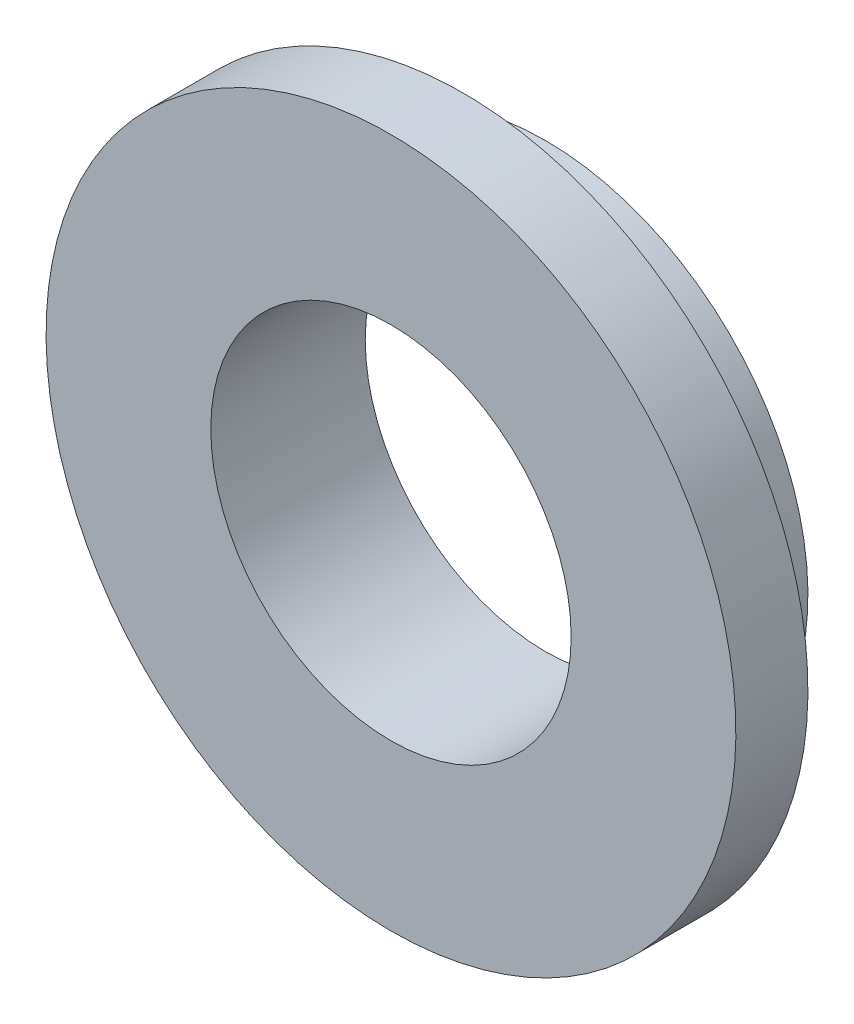
ISO-10303-21;
HEADER;
FILE_DESCRIPTION(('STEP AP214'),'2;1');
FILE_NAME('part.step','',(''),(''),'','','');
FILE_SCHEMA(('AUTOMOTIVE_DESIGN { 1 0 10303 214 1 1 1 1 }'));
ENDSEC;
DATA;
#1=APPLICATION_CONTEXT('core data for automotive mechanical design processes');
#2=APPLICATION_PROTOCOL_DEFINITION('international standard','automotive_design',2000,#1);
#3=PRODUCT_CONTEXT('',#1,'mechanical');
#4=PRODUCT('Part','Part','',(#3));
#5=PRODUCT_RELATED_PRODUCT_CATEGORY('part','',(#4));
#6=PRODUCT_DEFINITION_FORMATION('','',#4);
#7=PRODUCT_DEFINITION_CONTEXT('part definition',#1,'design');
#8=PRODUCT_DEFINITION('design','',#6,#7);
#9=PRODUCT_DEFINITION_SHAPE('','',#8);
#10=(LENGTH_UNIT() NAMED_UNIT(*) SI_UNIT(.MILLI.,.METRE.));
#11=(NAMED_UNIT(*) PLANE_ANGLE_UNIT() SI_UNIT($,.RADIAN.));
#12=(NAMED_UNIT(*) SI_UNIT($,.STERADIAN.) SOLID_ANGLE_UNIT());
#13=UNCERTAINTY_MEASURE_WITH_UNIT(LENGTH_MEASURE(1.E-05),#10,'distance_accuracy_value','');
#14=(GEOMETRIC_REPRESENTATION_CONTEXT(3) GLOBAL_UNCERTAINTY_ASSIGNED_CONTEXT((#13)) GLOBAL_UNIT_ASSIGNED_CONTEXT((#10,
#11,#12)) REPRESENTATION_CONTEXT('',''));
#15=CARTESIAN_POINT('',(0.,0.,0.));
#16=DIRECTION('',(0.,0.,1.));
#17=DIRECTION('',(1.,0.,0.));
#18=AXIS2_PLACEMENT_3D('',#15,#16,#17);
#19=CARTESIAN_POINT('',(-21.7679908457877,11.287620261908,13.2839378711217));
#20=DIRECTION('',(0.,0.,-1.));
#21=DIRECTION('',(0.,1.,0.));
#22=AXIS2_PLACEMENT_3D('',#19,#20,#21);
#23=CYLINDRICAL_SURFACE('',#22,12.75);
#24=CARTESIAN_POINT('',(-21.7679908457877,11.287620261908,9.28393787112174));
#25=DIRECTION('',(0.,0.,-1.));
#26=DIRECTION('',(0.,1.,0.));
#27=AXIS2_PLACEMENT_3D('',#24,#25,#26);
#28=CIRCLE('',#27,12.75);
#29=CARTESIAN_POINT('',(-21.7679908457877,24.037620261908,9.28393787112173));
#30=VERTEX_POINT('',#29);
#31=EDGE_CURVE('E18',#30,#30,#28,.F.);
#32=ORIENTED_EDGE('',*,*,#31,.T.);
#33=EDGE_LOOP('',(#32));
#34=FACE_BOUND('',#33,.T.);
#35=CARTESIAN_POINT('',(-21.7679908457877,11.287620261908,13.2839378711217));
#36=DIRECTION('',(0.,0.,-1.));
#37=DIRECTION('',(0.,1.,0.));
#38=AXIS2_PLACEMENT_3D('',#35,#36,#37);
#39=CIRCLE('',#38,12.75);
#40=CARTESIAN_POINT('',(-21.7679908457877,24.037620261908,13.2839378711217));
#41=VERTEX_POINT('',#40);
#42=EDGE_CURVE('E34',#41,#41,#39,.F.);
#43=ORIENTED_EDGE('',*,*,#42,.F.);
#44=EDGE_LOOP('',(#43));
#45=FACE_BOUND('',#44,.T.);
#46=ADVANCED_FACE('F15',(#34,#45),#23,.T.);
#47=CARTESIAN_POINT('',(-21.7679908457877,11.287620261908,9.28393787112174));
#48=DIRECTION('',(0.,0.,1.));
#49=DIRECTION('',(0.,-1.,0.));
#50=AXIS2_PLACEMENT_3D('',#47,#48,#49);
#51=PLANE('',#50);
#52=ORIENTED_EDGE('',*,*,#31,.F.);
#53=EDGE_LOOP('',(#52));
#54=FACE_BOUND('',#53,.T.);
#55=CARTESIAN_POINT('',(-21.7679908457877,11.287620261908,9.28393787112174));
#56=DIRECTION('',(0.,0.,1.));
#57=DIRECTION('',(0.,-1.,0.));
#58=AXIS2_PLACEMENT_3D('',#55,#56,#57);
#59=CIRCLE('',#58,8.75);
#60=CARTESIAN_POINT('',(-21.7679908457877,2.53762026190803,9.28393787112174));
#61=VERTEX_POINT('',#60);
#62=EDGE_CURVE('E32',#61,#61,#59,.T.);
#63=ORIENTED_EDGE('',*,*,#62,.T.);
#64=EDGE_LOOP('',(#63));
#65=FACE_BOUND('',#64,.T.);
#66=ADVANCED_FACE('F43',(#54,#65),#51,.F.);
#67=CARTESIAN_POINT('',(-21.7679908457877,11.287620261908,13.2839378711217));
#68=DIRECTION('',(0.,0.,-1.));
#69=DIRECTION('',(0.,1.,0.));
#70=AXIS2_PLACEMENT_3D('',#67,#68,#69);
#71=PLANE('',#70);
#72=CARTESIAN_POINT('',(-21.7679908457877,11.287620261908,13.2839378711217));
#73=DIRECTION('',(0.,0.,1.));
#74=DIRECTION('',(0.,-1.,0.));
#75=AXIS2_PLACEMENT_3D('',#72,#73,#74);
#76=CIRCLE('',#75,16.75);
#77=CARTESIAN_POINT('',(-21.7679908457877,-5.46237973809197,13.2839378711217));
#78=VERTEX_POINT('',#77);
#79=EDGE_CURVE('E27',#78,#78,#76,.T.);
#80=ORIENTED_EDGE('',*,*,#79,.F.);
#81=EDGE_LOOP('',(#80));
#82=FACE_BOUND('',#81,.T.);
#83=ORIENTED_EDGE('',*,*,#42,.T.);
#84=EDGE_LOOP('',(#83));
#85=FACE_BOUND('',#84,.T.);
#86=ADVANCED_FACE('F46',(#82,#85),#71,.T.);
#87=CARTESIAN_POINT('',(-21.7679908457877,11.287620261908,13.2839378711217));
#88=DIRECTION('',(0.,0.,1.));
#89=DIRECTION('',(0.,-1.,0.));
#90=AXIS2_PLACEMENT_3D('',#87,#88,#89);
#91=CYLINDRICAL_SURFACE('',#90,8.75);
#92=CARTESIAN_POINT('',(-21.7679908457877,11.287620261908,16.7839378711217));
#93=DIRECTION('',(0.,0.,1.));
#94=DIRECTION('',(0.,-1.,0.));
#95=AXIS2_PLACEMENT_3D('',#92,#93,#94);
#96=CIRCLE('',#95,8.75);
#97=CARTESIAN_POINT('',(-21.7679908457877,2.53762026190803,16.7839378711217));
#98=VERTEX_POINT('',#97);
#99=EDGE_CURVE('E22',#98,#98,#96,.T.);
#100=ORIENTED_EDGE('',*,*,#99,.T.);
#101=EDGE_LOOP('',(#100));
#102=FACE_BOUND('',#101,.T.);
#103=ORIENTED_EDGE('',*,*,#62,.F.);
#104=EDGE_LOOP('',(#103));
#105=FACE_BOUND('',#104,.T.);
#106=ADVANCED_FACE('F49',(#102,#105),#91,.F.);
#107=CARTESIAN_POINT('',(-21.7679908457877,11.287620261908,13.2839378711217));
#108=DIRECTION('',(0.,0.,1.));
#109=DIRECTION('',(0.,-1.,0.));
#110=AXIS2_PLACEMENT_3D('',#107,#108,#109);
#111=CYLINDRICAL_SURFACE('',#110,16.75);
#112=ORIENTED_EDGE('',*,*,#79,.T.);
#113=EDGE_LOOP('',(#112));
#114=FACE_BOUND('',#113,.T.);
#115=CARTESIAN_POINT('',(-21.7679908457877,11.287620261908,16.7839378711217));
#116=DIRECTION('',(0.,0.,1.));
#117=DIRECTION('',(0.,-1.,0.));
#118=AXIS2_PLACEMENT_3D('',#115,#116,#117);
#119=CIRCLE('',#118,16.75);
#120=CARTESIAN_POINT('',(-21.7679908457877,-5.46237973809197,16.7839378711217));
#121=VERTEX_POINT('',#120);
#122=EDGE_CURVE('E10',#121,#121,#119,.F.);
#123=ORIENTED_EDGE('',*,*,#122,.T.);
#124=EDGE_LOOP('',(#123));
#125=FACE_BOUND('',#124,.T.);
#126=ADVANCED_FACE('F51',(#114,#125),#111,.T.);
#127=CARTESIAN_POINT('',(-21.7679908457877,11.287620261908,16.7839378711217));
#128=DIRECTION('',(0.,0.,-1.));
#129=DIRECTION('',(0.,1.,0.));
#130=AXIS2_PLACEMENT_3D('',#127,#128,#129);
#131=PLANE('',#130);
#132=ORIENTED_EDGE('',*,*,#122,.F.);
#133=EDGE_LOOP('',(#132));
#134=FACE_BOUND('',#133,.T.);
#135=ORIENTED_EDGE('',*,*,#99,.F.);
#136=EDGE_LOOP('',(#135));
#137=FACE_BOUND('',#136,.T.);
#138=ADVANCED_FACE('F59',(#134,#137),#131,.F.);
#139=CLOSED_SHELL('',(#46,#66,#86,#106,#126,#138));
#140=MANIFOLD_SOLID_BREP('B1',#139);
#141=ADVANCED_BREP_SHAPE_REPRESENTATION('',(#18,#140),#14);
#142=SHAPE_DEFINITION_REPRESENTATION(#9,#141);
ENDSEC;
END-ISO-10303-21;
